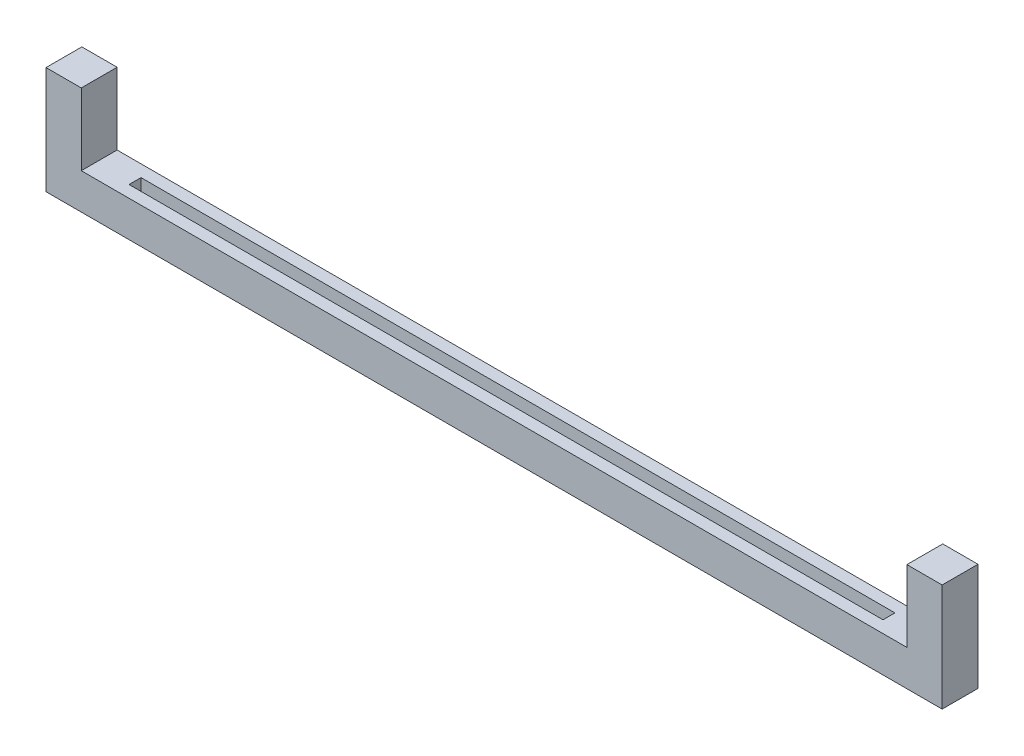
ISO-10303-21;
HEADER;
FILE_DESCRIPTION(('STEP AP214'),'2;1');
FILE_NAME('part.step','',(''),(''),'','','');
FILE_SCHEMA(('AUTOMOTIVE_DESIGN { 1 0 10303 214 1 1 1 1 }'));
ENDSEC;
DATA;
#1=APPLICATION_CONTEXT('core data for automotive mechanical design processes');
#2=APPLICATION_PROTOCOL_DEFINITION('international standard','automotive_design',2000,#1);
#3=PRODUCT_CONTEXT('',#1,'mechanical');
#4=PRODUCT('Part','Part','',(#3));
#5=PRODUCT_RELATED_PRODUCT_CATEGORY('part','',(#4));
#6=PRODUCT_DEFINITION_FORMATION('','',#4);
#7=PRODUCT_DEFINITION_CONTEXT('part definition',#1,'design');
#8=PRODUCT_DEFINITION('design','',#6,#7);
#9=PRODUCT_DEFINITION_SHAPE('','',#8);
#10=(LENGTH_UNIT() NAMED_UNIT(*) SI_UNIT(.MILLI.,.METRE.));
#11=(NAMED_UNIT(*) PLANE_ANGLE_UNIT() SI_UNIT($,.RADIAN.));
#12=(NAMED_UNIT(*) SI_UNIT($,.STERADIAN.) SOLID_ANGLE_UNIT());
#13=UNCERTAINTY_MEASURE_WITH_UNIT(LENGTH_MEASURE(1.E-05),#10,'distance_accuracy_value','');
#14=(GEOMETRIC_REPRESENTATION_CONTEXT(3) GLOBAL_UNCERTAINTY_ASSIGNED_CONTEXT((#13)) GLOBAL_UNIT_ASSIGNED_CONTEXT((#10,
#11,#12)) REPRESENTATION_CONTEXT('',''));
#15=CARTESIAN_POINT('',(0.,0.,0.));
#16=DIRECTION('',(0.,0.,1.));
#17=DIRECTION('',(1.,0.,0.));
#18=AXIS2_PLACEMENT_3D('',#15,#16,#17);
#19=CARTESIAN_POINT('',(-62.5,7.5,5.));
#20=DIRECTION('',(0.,-1.,0.));
#21=DIRECTION('',(0.,0.,-1.));
#22=AXIS2_PLACEMENT_3D('',#19,#20,#21);
#23=PLANE('',#22);
#24=DIRECTION('',(-1.,0.,0.));
#25=VECTOR('',#24,1.);
#26=CARTESIAN_POINT('',(-62.5,7.5,5.));
#27=LINE('',#26,#25);
#28=CARTESIAN_POINT('',(-57.58,7.5,5.));
#29=VERTEX_POINT('',#28);
#30=CARTESIAN_POINT('',(-62.5,7.5,5.));
#31=VERTEX_POINT('',#30);
#32=EDGE_CURVE('E189',#29,#31,#27,.T.);
#33=ORIENTED_EDGE('',*,*,#32,.F.);
#34=DIRECTION('',(0.,0.,1.));
#35=VECTOR('',#34,1.);
#36=CARTESIAN_POINT('',(-57.58,7.5,0.));
#37=LINE('',#36,#35);
#38=CARTESIAN_POINT('',(-57.58,7.5,0.));
#39=VERTEX_POINT('',#38);
#40=EDGE_CURVE('E154',#39,#29,#37,.T.);
#41=ORIENTED_EDGE('',*,*,#40,.F.);
#42=DIRECTION('',(-1.,0.,0.));
#43=VECTOR('',#42,1.);
#44=CARTESIAN_POINT('',(-62.5,7.5,0.));
#45=LINE('',#44,#43);
#46=CARTESIAN_POINT('',(-62.5,7.5,0.));
#47=VERTEX_POINT('',#46);
#48=EDGE_CURVE('E161',#39,#47,#45,.T.);
#49=ORIENTED_EDGE('',*,*,#48,.T.);
#50=DIRECTION('',(0.,0.,-1.));
#51=VECTOR('',#50,1.);
#52=CARTESIAN_POINT('',(-62.5,7.5,5.));
#53=LINE('',#52,#51);
#54=EDGE_CURVE('E170',#31,#47,#53,.T.);
#55=ORIENTED_EDGE('',*,*,#54,.F.);
#56=EDGE_LOOP('',(#33,#41,#49,#55));
#57=FACE_BOUND('',#56,.T.);
#58=ADVANCED_FACE('F42',(#57),#23,.F.);
#59=CARTESIAN_POINT('',(-62.5,-7.5,5.));
#60=DIRECTION('',(0.,1.,0.));
#61=DIRECTION('',(0.,0.,1.));
#62=AXIS2_PLACEMENT_3D('',#59,#60,#61);
#63=PLANE('',#62);
#64=DIRECTION('',(1.,0.,0.));
#65=VECTOR('',#64,1.);
#66=CARTESIAN_POINT('',(-62.5,-7.5,0.));
#67=LINE('',#66,#65);
#68=CARTESIAN_POINT('',(-62.5,-7.5,0.));
#69=VERTEX_POINT('',#68);
#70=CARTESIAN_POINT('',(62.5,-7.5,0.));
#71=VERTEX_POINT('',#70);
#72=EDGE_CURVE('E182',#69,#71,#67,.T.);
#73=ORIENTED_EDGE('',*,*,#72,.T.);
#74=DIRECTION('',(0.,0.,-1.));
#75=VECTOR('',#74,1.);
#76=CARTESIAN_POINT('',(62.5,-7.5,5.));
#77=LINE('',#76,#75);
#78=CARTESIAN_POINT('',(62.5,-7.5,5.));
#79=VERTEX_POINT('',#78);
#80=EDGE_CURVE('E50',#79,#71,#77,.T.);
#81=ORIENTED_EDGE('',*,*,#80,.F.);
#82=DIRECTION('',(1.,0.,0.));
#83=VECTOR('',#82,1.);
#84=CARTESIAN_POINT('',(-62.5,-7.5,5.));
#85=LINE('',#84,#83);
#86=CARTESIAN_POINT('',(-62.5,-7.5,5.));
#87=VERTEX_POINT('',#86);
#88=EDGE_CURVE('E164',#87,#79,#85,.T.);
#89=ORIENTED_EDGE('',*,*,#88,.F.);
#90=DIRECTION('',(0.,0.,-1.));
#91=VECTOR('',#90,1.);
#92=CARTESIAN_POINT('',(-62.5,-7.5,5.));
#93=LINE('',#92,#91);
#94=EDGE_CURVE('E11',#87,#69,#93,.T.);
#95=ORIENTED_EDGE('',*,*,#94,.T.);
#96=EDGE_LOOP('',(#73,#81,#89,#95));
#97=FACE_BOUND('',#96,.T.);
#98=DIRECTION('',(1.,0.,0.));
#99=VECTOR('',#98,1.);
#100=CARTESIAN_POINT('',(0.,-7.5,3.33333333333332));
#101=LINE('',#100,#99);
#102=CARTESIAN_POINT('',(-52.58,-7.5,3.33333333333332));
#103=VERTEX_POINT('',#102);
#104=CARTESIAN_POINT('',(52.58,-7.5,3.33333333333332));
#105=VERTEX_POINT('',#104);
#106=EDGE_CURVE('E57',#103,#105,#101,.T.);
#107=ORIENTED_EDGE('',*,*,#106,.T.);
#108=DIRECTION('',(0.,0.,-1.));
#109=VECTOR('',#108,1.);
#110=CARTESIAN_POINT('',(52.58,-7.5,0.));
#111=LINE('',#110,#109);
#112=CARTESIAN_POINT('',(52.58,-7.5,1.66666666666667));
#113=VERTEX_POINT('',#112);
#114=EDGE_CURVE('E216',#105,#113,#111,.T.);
#115=ORIENTED_EDGE('',*,*,#114,.T.);
#116=DIRECTION('',(1.,0.,0.));
#117=VECTOR('',#116,1.);
#118=CARTESIAN_POINT('',(0.,-7.5,1.66666666666667));
#119=LINE('',#118,#117);
#120=CARTESIAN_POINT('',(-52.58,-7.5,1.66666666666667));
#121=VERTEX_POINT('',#120);
#122=EDGE_CURVE('E223',#121,#113,#119,.T.);
#123=ORIENTED_EDGE('',*,*,#122,.F.);
#124=DIRECTION('',(0.,0.,-1.));
#125=VECTOR('',#124,1.);
#126=CARTESIAN_POINT('',(-52.58,-7.5,0.));
#127=LINE('',#126,#125);
#128=EDGE_CURVE('E226',#103,#121,#127,.T.);
#129=ORIENTED_EDGE('',*,*,#128,.F.);
#130=EDGE_LOOP('',(#107,#115,#123,#129));
#131=FACE_BOUND('',#130,.T.);
#132=ADVANCED_FACE('F246',(#97,#131),#63,.F.);
#133=CARTESIAN_POINT('',(62.5,7.5,0.));
#134=VERTEX_POINT('',#133);
#135=CARTESIAN_POINT('',(57.58,7.5,0.));
#136=VERTEX_POINT('',#135);
#137=EDGE_CURVE('E139',#134,#136,#45,.T.);
#138=ORIENTED_EDGE('',*,*,#137,.T.);
#139=DIRECTION('',(0.,0.,1.));
#140=VECTOR('',#139,1.);
#141=CARTESIAN_POINT('',(57.58,7.5,0.));
#142=LINE('',#141,#140);
#143=CARTESIAN_POINT('',(57.58,7.5,5.));
#144=VERTEX_POINT('',#143);
#145=EDGE_CURVE('E147',#136,#144,#142,.T.);
#146=ORIENTED_EDGE('',*,*,#145,.T.);
#147=CARTESIAN_POINT('',(62.5,7.5,5.));
#148=VERTEX_POINT('',#147);
#149=EDGE_CURVE('E173',#148,#144,#27,.T.);
#150=ORIENTED_EDGE('',*,*,#149,.F.);
#151=DIRECTION('',(0.,0.,-1.));
#152=VECTOR('',#151,1.);
#153=CARTESIAN_POINT('',(62.5,7.5,5.));
#154=LINE('',#153,#152);
#155=EDGE_CURVE('E159',#148,#134,#154,.T.);
#156=ORIENTED_EDGE('',*,*,#155,.T.);
#157=EDGE_LOOP('',(#138,#146,#150,#156));
#158=FACE_BOUND('',#157,.T.);
#159=ADVANCED_FACE('F157',(#158),#23,.F.);
#160=CARTESIAN_POINT('',(-57.58,-2.5,5.));
#161=DIRECTION('',(0.,1.,0.));
#162=DIRECTION('',(0.,0.,1.));
#163=AXIS2_PLACEMENT_3D('',#160,#161,#162);
#164=PLANE('',#163);
#165=DIRECTION('',(1.,0.,0.));
#166=VECTOR('',#165,1.);
#167=CARTESIAN_POINT('',(-57.58,-2.5,0.));
#168=LINE('',#167,#166);
#169=CARTESIAN_POINT('',(-57.58,-2.5,0.));
#170=VERTEX_POINT('',#169);
#171=CARTESIAN_POINT('',(57.58,-2.5,0.));
#172=VERTEX_POINT('',#171);
#173=EDGE_CURVE('E141',#170,#172,#168,.T.);
#174=ORIENTED_EDGE('',*,*,#173,.F.);
#175=DIRECTION('',(0.,0.,-1.));
#176=VECTOR('',#175,1.);
#177=CARTESIAN_POINT('',(-57.58,-2.5,5.));
#178=LINE('',#177,#176);
#179=CARTESIAN_POINT('',(-57.58,-2.5,5.));
#180=VERTEX_POINT('',#179);
#181=EDGE_CURVE('E185',#180,#170,#178,.T.);
#182=ORIENTED_EDGE('',*,*,#181,.F.);
#183=DIRECTION('',(1.,0.,0.));
#184=VECTOR('',#183,1.);
#185=CARTESIAN_POINT('',(-57.58,-2.5,5.));
#186=LINE('',#185,#184);
#187=CARTESIAN_POINT('',(57.58,-2.5,5.));
#188=VERTEX_POINT('',#187);
#189=EDGE_CURVE('E201',#180,#188,#186,.T.);
#190=ORIENTED_EDGE('',*,*,#189,.T.);
#191=DIRECTION('',(0.,0.,-1.));
#192=VECTOR('',#191,1.);
#193=CARTESIAN_POINT('',(57.58,-2.5,5.));
#194=LINE('',#193,#192);
#195=EDGE_CURVE('E194',#188,#172,#194,.T.);
#196=ORIENTED_EDGE('',*,*,#195,.T.);
#197=EDGE_LOOP('',(#174,#182,#190,#196));
#198=FACE_BOUND('',#197,.T.);
#199=DIRECTION('',(0.,0.,1.));
#200=VECTOR('',#199,1.);
#201=CARTESIAN_POINT('',(52.58,-2.5,5.));
#202=LINE('',#201,#200);
#203=CARTESIAN_POINT('',(52.58,-2.5,1.66666666666667));
#204=VERTEX_POINT('',#203);
#205=CARTESIAN_POINT('',(52.58,-2.5,3.33333333333332));
#206=VERTEX_POINT('',#205);
#207=EDGE_CURVE('E206',#204,#206,#202,.T.);
#208=ORIENTED_EDGE('',*,*,#207,.T.);
#209=DIRECTION('',(-1.,0.,0.));
#210=VECTOR('',#209,1.);
#211=CARTESIAN_POINT('',(-57.58,-2.5,3.33333333333332));
#212=LINE('',#211,#210);
#213=CARTESIAN_POINT('',(-52.58,-2.5,3.33333333333332));
#214=VERTEX_POINT('',#213);
#215=EDGE_CURVE('E199',#206,#214,#212,.T.);
#216=ORIENTED_EDGE('',*,*,#215,.T.);
#217=DIRECTION('',(0.,0.,1.));
#218=VECTOR('',#217,1.);
#219=CARTESIAN_POINT('',(-52.58,-2.5,5.));
#220=LINE('',#219,#218);
#221=CARTESIAN_POINT('',(-52.58,-2.5,1.66666666666667));
#222=VERTEX_POINT('',#221);
#223=EDGE_CURVE('E211',#222,#214,#220,.T.);
#224=ORIENTED_EDGE('',*,*,#223,.F.);
#225=DIRECTION('',(-1.,0.,0.));
#226=VECTOR('',#225,1.);
#227=CARTESIAN_POINT('',(-57.58,-2.5,1.66666666666667));
#228=LINE('',#227,#226);
#229=EDGE_CURVE('E209',#204,#222,#228,.T.);
#230=ORIENTED_EDGE('',*,*,#229,.F.);
#231=EDGE_LOOP('',(#208,#216,#224,#230));
#232=FACE_BOUND('',#231,.T.);
#233=ADVANCED_FACE('F243',(#198,#232),#164,.T.);
#234=CARTESIAN_POINT('',(0.,0.,5.));
#235=DIRECTION('',(0.,0.,1.));
#236=DIRECTION('',(1.,0.,0.));
#237=AXIS2_PLACEMENT_3D('',#234,#235,#236);
#238=PLANE('',#237);
#239=DIRECTION('',(0.,-1.,0.));
#240=VECTOR('',#239,1.);
#241=CARTESIAN_POINT('',(-57.58,2.5,5.));
#242=LINE('',#241,#240);
#243=EDGE_CURVE('E144',#29,#180,#242,.T.);
#244=ORIENTED_EDGE('',*,*,#243,.F.);
#245=ORIENTED_EDGE('',*,*,#32,.T.);
#246=DIRECTION('',(0.,-1.,0.));
#247=VECTOR('',#246,1.);
#248=CARTESIAN_POINT('',(-62.5,7.5,5.));
#249=LINE('',#248,#247);
#250=EDGE_CURVE('E160',#31,#87,#249,.T.);
#251=ORIENTED_EDGE('',*,*,#250,.T.);
#252=ORIENTED_EDGE('',*,*,#88,.T.);
#253=DIRECTION('',(0.,1.,0.));
#254=VECTOR('',#253,1.);
#255=CARTESIAN_POINT('',(62.5,7.5,5.));
#256=LINE('',#255,#254);
#257=EDGE_CURVE('E179',#79,#148,#256,.T.);
#258=ORIENTED_EDGE('',*,*,#257,.T.);
#259=ORIENTED_EDGE('',*,*,#149,.T.);
#260=DIRECTION('',(0.,1.,0.));
#261=VECTOR('',#260,1.);
#262=CARTESIAN_POINT('',(57.58,2.5,5.));
#263=LINE('',#262,#261);
#264=EDGE_CURVE('E150',#188,#144,#263,.T.);
#265=ORIENTED_EDGE('',*,*,#264,.F.);
#266=ORIENTED_EDGE('',*,*,#189,.F.);
#267=EDGE_LOOP('',(#244,#245,#251,#252,#258,#259,#265,#266));
#268=FACE_BOUND('',#267,.T.);
#269=ADVANCED_FACE('F239',(#268),#238,.T.);
#270=CARTESIAN_POINT('',(0.,0.,0.));
#271=DIRECTION('',(0.,0.,1.));
#272=DIRECTION('',(1.,0.,0.));
#273=AXIS2_PLACEMENT_3D('',#270,#271,#272);
#274=PLANE('',#273);
#275=ORIENTED_EDGE('',*,*,#48,.F.);
#276=DIRECTION('',(0.,-1.,0.));
#277=VECTOR('',#276,1.);
#278=CARTESIAN_POINT('',(-57.58,2.5,0.));
#279=LINE('',#278,#277);
#280=EDGE_CURVE('E197',#39,#170,#279,.T.);
#281=ORIENTED_EDGE('',*,*,#280,.T.);
#282=ORIENTED_EDGE('',*,*,#173,.T.);
#283=DIRECTION('',(0.,1.,0.));
#284=VECTOR('',#283,1.);
#285=CARTESIAN_POINT('',(57.58,2.5,0.));
#286=LINE('',#285,#284);
#287=EDGE_CURVE('E133',#172,#136,#286,.T.);
#288=ORIENTED_EDGE('',*,*,#287,.T.);
#289=ORIENTED_EDGE('',*,*,#137,.F.);
#290=DIRECTION('',(0.,1.,0.));
#291=VECTOR('',#290,1.);
#292=CARTESIAN_POINT('',(62.5,7.5,0.));
#293=LINE('',#292,#291);
#294=EDGE_CURVE('E166',#71,#134,#293,.T.);
#295=ORIENTED_EDGE('',*,*,#294,.F.);
#296=ORIENTED_EDGE('',*,*,#72,.F.);
#297=DIRECTION('',(0.,-1.,0.));
#298=VECTOR('',#297,1.);
#299=CARTESIAN_POINT('',(-62.5,7.5,0.));
#300=LINE('',#299,#298);
#301=EDGE_CURVE('E183',#47,#69,#300,.T.);
#302=ORIENTED_EDGE('',*,*,#301,.F.);
#303=EDGE_LOOP('',(#275,#281,#282,#288,#289,#295,#296,#302));
#304=FACE_BOUND('',#303,.T.);
#305=ADVANCED_FACE('F136',(#304),#274,.F.);
#306=CARTESIAN_POINT('',(-62.5,7.5,5.));
#307=DIRECTION('',(1.,0.,0.));
#308=DIRECTION('',(0.,0.,-1.));
#309=AXIS2_PLACEMENT_3D('',#306,#307,#308);
#310=PLANE('',#309);
#311=ORIENTED_EDGE('',*,*,#301,.T.);
#312=ORIENTED_EDGE('',*,*,#94,.F.);
#313=ORIENTED_EDGE('',*,*,#250,.F.);
#314=ORIENTED_EDGE('',*,*,#54,.T.);
#315=EDGE_LOOP('',(#311,#312,#313,#314));
#316=FACE_BOUND('',#315,.T.);
#317=ADVANCED_FACE('F44',(#316),#310,.F.);
#318=CARTESIAN_POINT('',(62.5,7.5,5.));
#319=DIRECTION('',(-1.,0.,0.));
#320=DIRECTION('',(0.,0.,1.));
#321=AXIS2_PLACEMENT_3D('',#318,#319,#320);
#322=PLANE('',#321);
#323=ORIENTED_EDGE('',*,*,#294,.T.);
#324=ORIENTED_EDGE('',*,*,#155,.F.);
#325=ORIENTED_EDGE('',*,*,#257,.F.);
#326=ORIENTED_EDGE('',*,*,#80,.T.);
#327=EDGE_LOOP('',(#323,#324,#325,#326));
#328=FACE_BOUND('',#327,.T.);
#329=ADVANCED_FACE('F178',(#328),#322,.F.);
#330=CARTESIAN_POINT('',(-57.58,2.5,5.));
#331=DIRECTION('',(1.,0.,0.));
#332=DIRECTION('',(0.,0.,-1.));
#333=AXIS2_PLACEMENT_3D('',#330,#331,#332);
#334=PLANE('',#333);
#335=ORIENTED_EDGE('',*,*,#280,.F.);
#336=ORIENTED_EDGE('',*,*,#40,.T.);
#337=ORIENTED_EDGE('',*,*,#243,.T.);
#338=ORIENTED_EDGE('',*,*,#181,.T.);
#339=EDGE_LOOP('',(#335,#336,#337,#338));
#340=FACE_BOUND('',#339,.T.);
#341=ADVANCED_FACE('F233',(#340),#334,.T.);
#342=CARTESIAN_POINT('',(57.58,2.5,5.));
#343=DIRECTION('',(-1.,0.,0.));
#344=DIRECTION('',(0.,0.,1.));
#345=AXIS2_PLACEMENT_3D('',#342,#343,#344);
#346=PLANE('',#345);
#347=ORIENTED_EDGE('',*,*,#287,.F.);
#348=ORIENTED_EDGE('',*,*,#195,.F.);
#349=ORIENTED_EDGE('',*,*,#264,.T.);
#350=ORIENTED_EDGE('',*,*,#145,.F.);
#351=EDGE_LOOP('',(#347,#348,#349,#350));
#352=FACE_BOUND('',#351,.T.);
#353=ADVANCED_FACE('F148',(#352),#346,.T.);
#354=CARTESIAN_POINT('',(0.,7.5,3.33333333333332));
#355=DIRECTION('',(0.,0.,-1.));
#356=DIRECTION('',(-1.,0.,0.));
#357=AXIS2_PLACEMENT_3D('',#354,#355,#356);
#358=PLANE('',#357);
#359=DIRECTION('',(0.,-1.,0.));
#360=VECTOR('',#359,1.);
#361=CARTESIAN_POINT('',(52.58,7.5,3.33333333333332));
#362=LINE('',#361,#360);
#363=EDGE_CURVE('E213',#206,#105,#362,.T.);
#364=ORIENTED_EDGE('',*,*,#363,.T.);
#365=ORIENTED_EDGE('',*,*,#106,.F.);
#366=DIRECTION('',(0.,-1.,0.));
#367=VECTOR('',#366,1.);
#368=CARTESIAN_POINT('',(-52.58,7.5,3.33333333333332));
#369=LINE('',#368,#367);
#370=EDGE_CURVE('E214',#214,#103,#369,.T.);
#371=ORIENTED_EDGE('',*,*,#370,.F.);
#372=ORIENTED_EDGE('',*,*,#215,.F.);
#373=EDGE_LOOP('',(#364,#365,#371,#372));
#374=FACE_BOUND('',#373,.T.);
#375=ADVANCED_FACE('F254',(#374),#358,.T.);
#376=CARTESIAN_POINT('',(52.58,7.5,0.));
#377=DIRECTION('',(-1.,0.,0.));
#378=DIRECTION('',(0.,0.,1.));
#379=AXIS2_PLACEMENT_3D('',#376,#377,#378);
#380=PLANE('',#379);
#381=DIRECTION('',(0.,-1.,0.));
#382=VECTOR('',#381,1.);
#383=CARTESIAN_POINT('',(52.58,7.5,1.66666666666667));
#384=LINE('',#383,#382);
#385=EDGE_CURVE('E218',#204,#113,#384,.T.);
#386=ORIENTED_EDGE('',*,*,#385,.T.);
#387=ORIENTED_EDGE('',*,*,#114,.F.);
#388=ORIENTED_EDGE('',*,*,#363,.F.);
#389=ORIENTED_EDGE('',*,*,#207,.F.);
#390=EDGE_LOOP('',(#386,#387,#388,#389));
#391=FACE_BOUND('',#390,.T.);
#392=ADVANCED_FACE('F259',(#391),#380,.T.);
#393=CARTESIAN_POINT('',(0.,7.5,1.66666666666667));
#394=DIRECTION('',(0.,0.,-1.));
#395=DIRECTION('',(-1.,0.,0.));
#396=AXIS2_PLACEMENT_3D('',#393,#394,#395);
#397=PLANE('',#396);
#398=ORIENTED_EDGE('',*,*,#229,.T.);
#399=DIRECTION('',(0.,-1.,0.));
#400=VECTOR('',#399,1.);
#401=CARTESIAN_POINT('',(-52.58,7.5,1.66666666666667));
#402=LINE('',#401,#400);
#403=EDGE_CURVE('E65',#222,#121,#402,.T.);
#404=ORIENTED_EDGE('',*,*,#403,.T.);
#405=ORIENTED_EDGE('',*,*,#122,.T.);
#406=ORIENTED_EDGE('',*,*,#385,.F.);
#407=EDGE_LOOP('',(#398,#404,#405,#406));
#408=FACE_BOUND('',#407,.T.);
#409=ADVANCED_FACE('F261',(#408),#397,.F.);
#410=CARTESIAN_POINT('',(-52.58,7.5,0.));
#411=DIRECTION('',(-1.,0.,0.));
#412=DIRECTION('',(0.,0.,1.));
#413=AXIS2_PLACEMENT_3D('',#410,#411,#412);
#414=PLANE('',#413);
#415=ORIENTED_EDGE('',*,*,#223,.T.);
#416=ORIENTED_EDGE('',*,*,#370,.T.);
#417=ORIENTED_EDGE('',*,*,#128,.T.);
#418=ORIENTED_EDGE('',*,*,#403,.F.);
#419=EDGE_LOOP('',(#415,#416,#417,#418));
#420=FACE_BOUND('',#419,.T.);
#421=ADVANCED_FACE('F252',(#420),#414,.F.);
#422=CLOSED_SHELL('',(#58,#132,#159,#233,#269,#305,#317,#329,#341,#353,#375,#392,#409,#421));
#423=MANIFOLD_SOLID_BREP('B2',#422);
#424=ADVANCED_BREP_SHAPE_REPRESENTATION('',(#18,#423),#14);
#425=SHAPE_DEFINITION_REPRESENTATION(#9,#424);
ENDSEC;
END-ISO-10303-21;
